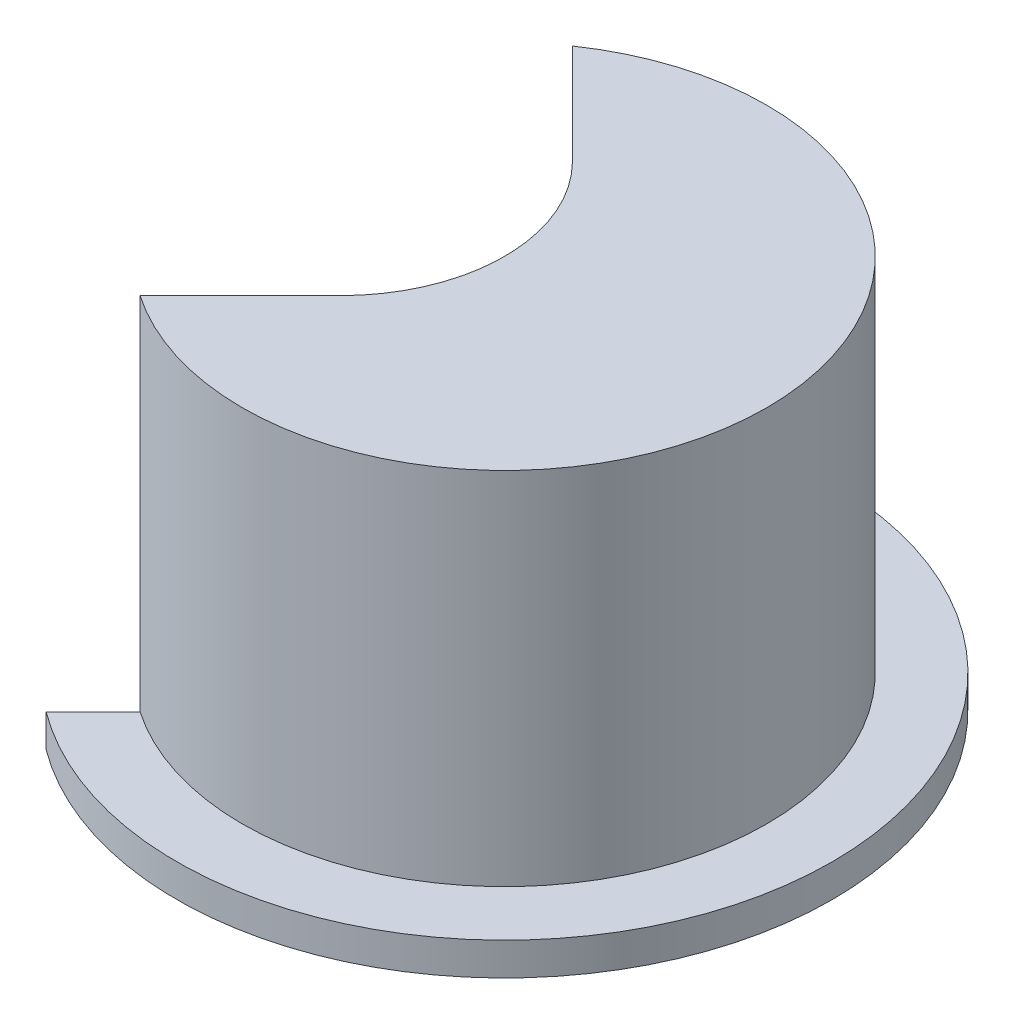
ISO-10303-21;
HEADER;
FILE_DESCRIPTION(('STEP AP214'),'2;1');
FILE_NAME('part.step','',(''),(''),'','','');
FILE_SCHEMA(('AUTOMOTIVE_DESIGN { 1 0 10303 214 1 1 1 1 }'));
ENDSEC;
DATA;
#1=APPLICATION_CONTEXT('core data for automotive mechanical design processes');
#2=APPLICATION_PROTOCOL_DEFINITION('international standard','automotive_design',2000,#1);
#3=PRODUCT_CONTEXT('',#1,'mechanical');
#4=PRODUCT('Part','Part','',(#3));
#5=PRODUCT_RELATED_PRODUCT_CATEGORY('part','',(#4));
#6=PRODUCT_DEFINITION_FORMATION('','',#4);
#7=PRODUCT_DEFINITION_CONTEXT('part definition',#1,'design');
#8=PRODUCT_DEFINITION('design','',#6,#7);
#9=PRODUCT_DEFINITION_SHAPE('','',#8);
#10=(LENGTH_UNIT() NAMED_UNIT(*) SI_UNIT(.MILLI.,.METRE.));
#11=(NAMED_UNIT(*) PLANE_ANGLE_UNIT() SI_UNIT($,.RADIAN.));
#12=(NAMED_UNIT(*) SI_UNIT($,.STERADIAN.) SOLID_ANGLE_UNIT());
#13=UNCERTAINTY_MEASURE_WITH_UNIT(LENGTH_MEASURE(1.E-05),#10,'distance_accuracy_value','');
#14=(GEOMETRIC_REPRESENTATION_CONTEXT(3) GLOBAL_UNCERTAINTY_ASSIGNED_CONTEXT((#13)) GLOBAL_UNIT_ASSIGNED_CONTEXT((#10,
#11,#12)) REPRESENTATION_CONTEXT('',''));
#15=CARTESIAN_POINT('',(0.,0.,0.));
#16=DIRECTION('',(0.,0.,1.));
#17=DIRECTION('',(1.,0.,0.));
#18=AXIS2_PLACEMENT_3D('',#15,#16,#17);
#19=CARTESIAN_POINT('',(0.,0.5,0.));
#20=DIRECTION('',(0.,1.,0.));
#21=DIRECTION('',(0.,0.,1.));
#22=AXIS2_PLACEMENT_3D('',#19,#20,#21);
#23=PLANE('',#22);
#24=DIRECTION('',(0.707106781186551,0.,-0.707106781186544));
#25=VECTOR('',#24,1.);
#26=CARTESIAN_POINT('',(0.517766952966372,0.5,0.517766952966378));
#27=LINE('',#26,#25);
#28=CARTESIAN_POINT('',(-2.97964886194841,0.5,4.01518276788112));
#29=VERTEX_POINT('',#28);
#30=CARTESIAN_POINT('',(-2.2628655978062,0.5,3.29839950373892));
#31=VERTEX_POINT('',#30);
#32=EDGE_CURVE('E88',#29,#31,#27,.T.);
#33=ORIENTED_EDGE('',*,*,#32,.F.);
#34=CARTESIAN_POINT('',(0.,0.5,0.));
#35=DIRECTION('',(0.,1.,0.));
#36=DIRECTION('',(0.,0.,1.));
#37=AXIS2_PLACEMENT_3D('',#34,#35,#36);
#38=CIRCLE('',#37,5.);
#39=CARTESIAN_POINT('',(-2.97964886194841,0.5,-4.01518276788112));
#40=VERTEX_POINT('',#39);
#41=EDGE_CURVE('E12',#29,#40,#38,.T.);
#42=ORIENTED_EDGE('',*,*,#41,.T.);
#43=DIRECTION('',(0.707106781186551,0.,0.707106781186544));
#44=VECTOR('',#43,1.);
#45=CARTESIAN_POINT('',(0.517766952966372,0.5,-0.517766952966378));
#46=LINE('',#45,#44);
#47=CARTESIAN_POINT('',(-2.2628655978062,0.5,-3.29839950373892));
#48=VERTEX_POINT('',#47);
#49=EDGE_CURVE('E154',#40,#48,#46,.T.);
#50=ORIENTED_EDGE('',*,*,#49,.T.);
#51=CARTESIAN_POINT('',(0.,0.5,0.));
#52=DIRECTION('',(0.,1.,0.));
#53=DIRECTION('',(0.,0.,1.));
#54=AXIS2_PLACEMENT_3D('',#51,#52,#53);
#55=CIRCLE('',#54,4.);
#56=EDGE_CURVE('E161',#31,#48,#55,.T.);
#57=ORIENTED_EDGE('',*,*,#56,.F.);
#58=EDGE_LOOP('',(#33,#42,#50,#57));
#59=FACE_BOUND('',#58,.T.);
#60=ADVANCED_FACE('F65',(#59),#23,.T.);
#61=CARTESIAN_POINT('',(0.,0.,0.));
#62=DIRECTION('',(0.,1.,0.));
#63=DIRECTION('',(0.,0.,1.));
#64=AXIS2_PLACEMENT_3D('',#61,#62,#63);
#65=PLANE('',#64);
#66=CARTESIAN_POINT('',(0.,0.,0.));
#67=DIRECTION('',(0.,1.,0.));
#68=DIRECTION('',(0.,0.,1.));
#69=AXIS2_PLACEMENT_3D('',#66,#67,#68);
#70=CIRCLE('',#69,5.);
#71=CARTESIAN_POINT('',(-2.97964886194841,0.,4.01518276788112));
#72=VERTEX_POINT('',#71);
#73=CARTESIAN_POINT('',(-2.97964886194841,0.,-4.01518276788112));
#74=VERTEX_POINT('',#73);
#75=EDGE_CURVE('E69',#72,#74,#70,.T.);
#76=ORIENTED_EDGE('',*,*,#75,.F.);
#77=DIRECTION('',(-0.707106781186551,0.,0.707106781186544));
#78=VECTOR('',#77,1.);
#79=CARTESIAN_POINT('',(0.517766952966372,0.,0.517766952966378));
#80=LINE('',#79,#78);
#81=CARTESIAN_POINT('',(-0.732233047033641,0.,1.76776695296638));
#82=VERTEX_POINT('',#81);
#83=EDGE_CURVE('E140',#82,#72,#80,.T.);
#84=ORIENTED_EDGE('',*,*,#83,.F.);
#85=CARTESIAN_POINT('',(-2.5,0.,0.));
#86=DIRECTION('',(0.,1.,0.));
#87=DIRECTION('',(0.,0.,1.));
#88=AXIS2_PLACEMENT_3D('',#85,#86,#87);
#89=CIRCLE('',#88,2.5);
#90=CARTESIAN_POINT('',(-0.732233047033642,0.,-1.76776695296638));
#91=VERTEX_POINT('',#90);
#92=EDGE_CURVE('E124',#82,#91,#89,.T.);
#93=ORIENTED_EDGE('',*,*,#92,.T.);
#94=DIRECTION('',(-0.707106781186551,0.,-0.707106781186544));
#95=VECTOR('',#94,1.);
#96=CARTESIAN_POINT('',(-0.732233047033641,0.,-1.76776695296638));
#97=LINE('',#96,#95);
#98=EDGE_CURVE('E148',#91,#74,#97,.T.);
#99=ORIENTED_EDGE('',*,*,#98,.T.);
#100=EDGE_LOOP('',(#76,#84,#93,#99));
#101=FACE_BOUND('',#100,.T.);
#102=ADVANCED_FACE('F172',(#101),#65,.F.);
#103=CARTESIAN_POINT('',(0.,0.5,0.));
#104=DIRECTION('',(0.,-1.,0.));
#105=DIRECTION('',(0.,0.,-1.));
#106=AXIS2_PLACEMENT_3D('',#103,#104,#105);
#107=CYLINDRICAL_SURFACE('',#106,5.);
#108=ORIENTED_EDGE('',*,*,#41,.F.);
#109=DIRECTION('',(0.,-1.,0.));
#110=VECTOR('',#109,1.);
#111=CARTESIAN_POINT('',(-2.97964886194841,6.,4.01518276788112));
#112=LINE('',#111,#110);
#113=EDGE_CURVE('E126',#29,#72,#112,.T.);
#114=ORIENTED_EDGE('',*,*,#113,.T.);
#115=ORIENTED_EDGE('',*,*,#75,.T.);
#116=DIRECTION('',(0.,-1.,0.));
#117=VECTOR('',#116,1.);
#118=CARTESIAN_POINT('',(-2.97964886194841,6.,-4.01518276788112));
#119=LINE('',#118,#117);
#120=EDGE_CURVE('E147',#40,#74,#119,.T.);
#121=ORIENTED_EDGE('',*,*,#120,.F.);
#122=EDGE_LOOP('',(#108,#114,#115,#121));
#123=FACE_BOUND('',#122,.T.);
#124=ADVANCED_FACE('F67',(#123),#107,.T.);
#125=CARTESIAN_POINT('',(0.,6.,0.));
#126=DIRECTION('',(0.,-1.,0.));
#127=DIRECTION('',(0.,0.,-1.));
#128=AXIS2_PLACEMENT_3D('',#125,#126,#127);
#129=CYLINDRICAL_SURFACE('',#128,4.);
#130=CARTESIAN_POINT('',(0.,6.,0.));
#131=DIRECTION('',(0.,1.,0.));
#132=DIRECTION('',(0.,0.,1.));
#133=AXIS2_PLACEMENT_3D('',#130,#131,#132);
#134=CIRCLE('',#133,4.);
#135=CARTESIAN_POINT('',(-2.2628655978062,6.,3.29839950373892));
#136=VERTEX_POINT('',#135);
#137=CARTESIAN_POINT('',(-2.2628655978062,6.,-3.29839950373892));
#138=VERTEX_POINT('',#137);
#139=EDGE_CURVE('E159',#136,#138,#134,.T.);
#140=ORIENTED_EDGE('',*,*,#139,.F.);
#141=DIRECTION('',(0.,-1.,0.));
#142=VECTOR('',#141,1.);
#143=CARTESIAN_POINT('',(-2.2628655978062,6.,3.29839950373892));
#144=LINE('',#143,#142);
#145=EDGE_CURVE('E131',#136,#31,#144,.T.);
#146=ORIENTED_EDGE('',*,*,#145,.T.);
#147=ORIENTED_EDGE('',*,*,#56,.T.);
#148=DIRECTION('',(0.,-1.,0.));
#149=VECTOR('',#148,1.);
#150=CARTESIAN_POINT('',(-2.2628655978062,6.,-3.29839950373892));
#151=LINE('',#150,#149);
#152=EDGE_CURVE('E145',#138,#48,#151,.T.);
#153=ORIENTED_EDGE('',*,*,#152,.F.);
#154=EDGE_LOOP('',(#140,#146,#147,#153));
#155=FACE_BOUND('',#154,.T.);
#156=ADVANCED_FACE('F181',(#155),#129,.T.);
#157=CARTESIAN_POINT('',(0.,6.,0.));
#158=DIRECTION('',(0.,1.,0.));
#159=DIRECTION('',(0.,0.,1.));
#160=AXIS2_PLACEMENT_3D('',#157,#158,#159);
#161=PLANE('',#160);
#162=DIRECTION('',(-0.707106781186551,0.,0.707106781186544));
#163=VECTOR('',#162,1.);
#164=CARTESIAN_POINT('',(0.517766952966372,6.,0.517766952966378));
#165=LINE('',#164,#163);
#166=CARTESIAN_POINT('',(-0.732233047033641,6.,1.76776695296638));
#167=VERTEX_POINT('',#166);
#168=EDGE_CURVE('E129',#167,#136,#165,.T.);
#169=ORIENTED_EDGE('',*,*,#168,.T.);
#170=ORIENTED_EDGE('',*,*,#139,.T.);
#171=DIRECTION('',(-0.707106781186551,0.,-0.707106781186544));
#172=VECTOR('',#171,1.);
#173=CARTESIAN_POINT('',(-0.732233047033641,6.,-1.76776695296638));
#174=LINE('',#173,#172);
#175=CARTESIAN_POINT('',(-0.732233047033642,6.,-1.76776695296638));
#176=VERTEX_POINT('',#175);
#177=EDGE_CURVE('E137',#176,#138,#174,.T.);
#178=ORIENTED_EDGE('',*,*,#177,.F.);
#179=CARTESIAN_POINT('',(-2.5,6.,0.));
#180=DIRECTION('',(0.,1.,0.));
#181=DIRECTION('',(0.,0.,1.));
#182=AXIS2_PLACEMENT_3D('',#179,#180,#181);
#183=CIRCLE('',#182,2.5);
#184=EDGE_CURVE('E121',#167,#176,#183,.T.);
#185=ORIENTED_EDGE('',*,*,#184,.F.);
#186=EDGE_LOOP('',(#169,#170,#178,#185));
#187=FACE_BOUND('',#186,.T.);
#188=ADVANCED_FACE('F136',(#187),#161,.T.);
#189=CARTESIAN_POINT('',(-2.5,6.,0.));
#190=DIRECTION('',(0.,-1.,0.));
#191=DIRECTION('',(0.,0.,-1.));
#192=AXIS2_PLACEMENT_3D('',#189,#190,#191);
#193=CYLINDRICAL_SURFACE('',#192,2.5);
#194=ORIENTED_EDGE('',*,*,#92,.F.);
#195=DIRECTION('',(0.,-1.,0.));
#196=VECTOR('',#195,1.);
#197=CARTESIAN_POINT('',(-0.732233047033641,6.,1.76776695296638));
#198=LINE('',#197,#196);
#199=EDGE_CURVE('E117',#167,#82,#198,.T.);
#200=ORIENTED_EDGE('',*,*,#199,.F.);
#201=ORIENTED_EDGE('',*,*,#184,.T.);
#202=DIRECTION('',(0.,-1.,0.));
#203=VECTOR('',#202,1.);
#204=CARTESIAN_POINT('',(-0.732233047033642,6.,-1.76776695296638));
#205=LINE('',#204,#203);
#206=EDGE_CURVE('E80',#176,#91,#205,.T.);
#207=ORIENTED_EDGE('',*,*,#206,.T.);
#208=EDGE_LOOP('',(#194,#200,#201,#207));
#209=FACE_BOUND('',#208,.T.);
#210=ADVANCED_FACE('F119',(#209),#193,.F.);
#211=CARTESIAN_POINT('',(0.517766952966372,6.,0.517766952966378));
#212=DIRECTION('',(0.707106781186544,0.,0.707106781186551));
#213=DIRECTION('',(0.707106781186551,0.,-0.707106781186544));
#214=AXIS2_PLACEMENT_3D('',#211,#212,#213);
#215=PLANE('',#214);
#216=ORIENTED_EDGE('',*,*,#32,.T.);
#217=ORIENTED_EDGE('',*,*,#145,.F.);
#218=ORIENTED_EDGE('',*,*,#168,.F.);
#219=ORIENTED_EDGE('',*,*,#199,.T.);
#220=ORIENTED_EDGE('',*,*,#83,.T.);
#221=ORIENTED_EDGE('',*,*,#113,.F.);
#222=EDGE_LOOP('',(#216,#217,#218,#219,#220,#221));
#223=FACE_BOUND('',#222,.T.);
#224=ADVANCED_FACE('F130',(#223),#215,.F.);
#225=CARTESIAN_POINT('',(-0.732233047033641,6.,-1.76776695296638));
#226=DIRECTION('',(-0.707106781186544,0.,0.707106781186551));
#227=DIRECTION('',(0.707106781186551,0.,0.707106781186544));
#228=AXIS2_PLACEMENT_3D('',#225,#226,#227);
#229=PLANE('',#228);
#230=ORIENTED_EDGE('',*,*,#120,.T.);
#231=ORIENTED_EDGE('',*,*,#98,.F.);
#232=ORIENTED_EDGE('',*,*,#206,.F.);
#233=ORIENTED_EDGE('',*,*,#177,.T.);
#234=ORIENTED_EDGE('',*,*,#152,.T.);
#235=ORIENTED_EDGE('',*,*,#49,.F.);
#236=EDGE_LOOP('',(#230,#231,#232,#233,#234,#235));
#237=FACE_BOUND('',#236,.T.);
#238=ADVANCED_FACE('F173',(#237),#229,.T.);
#239=CLOSED_SHELL('',(#60,#102,#124,#156,#188,#210,#224,#238));
#240=MANIFOLD_SOLID_BREP('B2',#239);
#241=ADVANCED_BREP_SHAPE_REPRESENTATION('',(#18,#240),#14);
#242=SHAPE_DEFINITION_REPRESENTATION(#9,#241);
ENDSEC;
END-ISO-10303-21;
